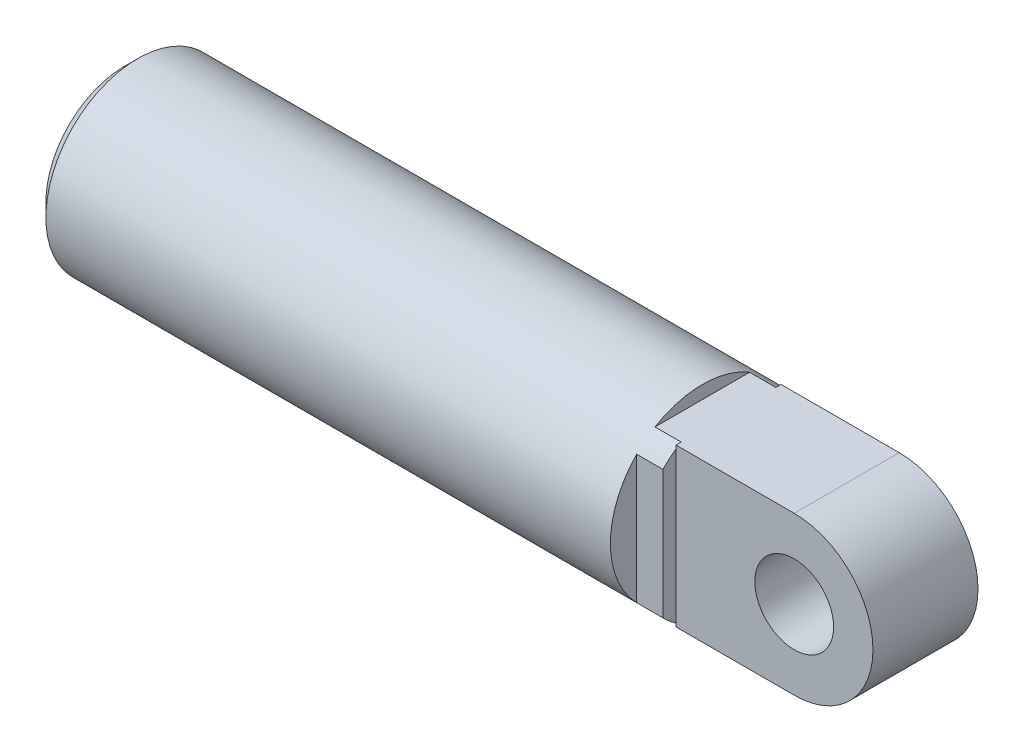
ISO-10303-21;
HEADER;
FILE_DESCRIPTION(('STEP AP214'),'2;1');
FILE_NAME('part.step','',(''),(''),'','','');
FILE_SCHEMA(('AUTOMOTIVE_DESIGN { 1 0 10303 214 1 1 1 1 }'));
ENDSEC;
DATA;
#1=APPLICATION_CONTEXT('core data for automotive mechanical design processes');
#2=APPLICATION_PROTOCOL_DEFINITION('international standard','automotive_design',2000,#1);
#3=PRODUCT_CONTEXT('',#1,'mechanical');
#4=PRODUCT('Part','Part','',(#3));
#5=PRODUCT_RELATED_PRODUCT_CATEGORY('part','',(#4));
#6=PRODUCT_DEFINITION_FORMATION('','',#4);
#7=PRODUCT_DEFINITION_CONTEXT('part definition',#1,'design');
#8=PRODUCT_DEFINITION('design','',#6,#7);
#9=PRODUCT_DEFINITION_SHAPE('','',#8);
#10=(LENGTH_UNIT() NAMED_UNIT(*) SI_UNIT(.MILLI.,.METRE.));
#11=(NAMED_UNIT(*) PLANE_ANGLE_UNIT() SI_UNIT($,.RADIAN.));
#12=(NAMED_UNIT(*) SI_UNIT($,.STERADIAN.) SOLID_ANGLE_UNIT());
#13=UNCERTAINTY_MEASURE_WITH_UNIT(LENGTH_MEASURE(1.E-05),#10,'distance_accuracy_value','');
#14=(GEOMETRIC_REPRESENTATION_CONTEXT(3) GLOBAL_UNCERTAINTY_ASSIGNED_CONTEXT((#13)) GLOBAL_UNIT_ASSIGNED_CONTEXT((#10,
#11,#12)) REPRESENTATION_CONTEXT('',''));
#15=CARTESIAN_POINT('',(0.,0.,0.));
#16=DIRECTION('',(0.,0.,1.));
#17=DIRECTION('',(1.,0.,0.));
#18=AXIS2_PLACEMENT_3D('',#15,#16,#17);
#19=CARTESIAN_POINT('',(46.,0.,0.));
#20=DIRECTION('',(1.,0.,0.));
#21=DIRECTION('',(0.,0.,-1.));
#22=AXIS2_PLACEMENT_3D('',#19,#20,#21);
#23=PLANE('',#22);
#24=CARTESIAN_POINT('',(46.,0.,0.));
#25=DIRECTION('',(1.,0.,0.));
#26=DIRECTION('',(0.,0.,-1.));
#27=AXIS2_PLACEMENT_3D('',#24,#25,#26);
#28=CIRCLE('',#27,7.);
#29=CARTESIAN_POINT('',(46.,4.89897948556636,-5.));
#30=VERTEX_POINT('',#29);
#31=CARTESIAN_POINT('',(46.,5.74456264653803,-4.));
#32=VERTEX_POINT('',#31);
#33=EDGE_CURVE('E210',#30,#32,#28,.T.);
#34=ORIENTED_EDGE('',*,*,#33,.T.);
#35=DIRECTION('',(0.,-1.,0.));
#36=VECTOR('',#35,1.);
#37=CARTESIAN_POINT('',(46.,-6.,-4.));
#38=LINE('',#37,#36);
#39=CARTESIAN_POINT('',(46.,-5.74456264653803,-4.));
#40=VERTEX_POINT('',#39);
#41=EDGE_CURVE('E187',#32,#40,#38,.T.);
#42=ORIENTED_EDGE('',*,*,#41,.T.);
#43=CARTESIAN_POINT('',(46.,0.,0.));
#44=DIRECTION('',(1.,0.,0.));
#45=DIRECTION('',(0.,0.,-1.));
#46=AXIS2_PLACEMENT_3D('',#43,#44,#45);
#47=CIRCLE('',#46,7.);
#48=CARTESIAN_POINT('',(46.,-4.89897948556636,-5.));
#49=VERTEX_POINT('',#48);
#50=EDGE_CURVE('E208',#40,#49,#47,.T.);
#51=ORIENTED_EDGE('',*,*,#50,.T.);
#52=DIRECTION('',(0.,1.,0.));
#53=VECTOR('',#52,1.);
#54=CARTESIAN_POINT('',(46.,-4.89897948556636,-5.));
#55=LINE('',#54,#53);
#56=EDGE_CURVE('E207',#49,#30,#55,.T.);
#57=ORIENTED_EDGE('',*,*,#56,.T.);
#58=EDGE_LOOP('',(#34,#42,#51,#57));
#59=FACE_BOUND('',#58,.T.);
#60=ADVANCED_FACE('F41',(#59),#23,.T.);
#61=CARTESIAN_POINT('',(44.,0.,0.));
#62=DIRECTION('',(1.,0.,0.));
#63=DIRECTION('',(0.,0.,-1.));
#64=AXIS2_PLACEMENT_3D('',#61,#62,#63);
#65=PLANE('',#64);
#66=DIRECTION('',(0.,0.,-1.));
#67=VECTOR('',#66,1.);
#68=CARTESIAN_POINT('',(44.,-6.,3.60555127546399));
#69=LINE('',#68,#67);
#70=CARTESIAN_POINT('',(44.,-6.,3.60555127546399));
#71=VERTEX_POINT('',#70);
#72=CARTESIAN_POINT('',(44.,-6.,-3.60555127546399));
#73=VERTEX_POINT('',#72);
#74=EDGE_CURVE('E230',#71,#73,#69,.T.);
#75=ORIENTED_EDGE('',*,*,#74,.F.);
#76=CARTESIAN_POINT('',(44.,0.,0.));
#77=DIRECTION('',(1.,0.,0.));
#78=DIRECTION('',(0.,0.,-1.));
#79=AXIS2_PLACEMENT_3D('',#76,#77,#78);
#80=CIRCLE('',#79,7.);
#81=EDGE_CURVE('E257',#71,#73,#80,.T.);
#82=ORIENTED_EDGE('',*,*,#81,.T.);
#83=EDGE_LOOP('',(#75,#82));
#84=FACE_BOUND('',#83,.T.);
#85=ADVANCED_FACE('F326',(#84),#65,.T.);
#86=DIRECTION('',(0.,-1.,0.));
#87=VECTOR('',#86,1.);
#88=CARTESIAN_POINT('',(44.,-4.89897948556636,5.));
#89=LINE('',#88,#87);
#90=CARTESIAN_POINT('',(44.,4.89897948556636,5.));
#91=VERTEX_POINT('',#90);
#92=CARTESIAN_POINT('',(44.,-4.89897948556636,5.));
#93=VERTEX_POINT('',#92);
#94=EDGE_CURVE('E227',#91,#93,#89,.T.);
#95=ORIENTED_EDGE('',*,*,#94,.F.);
#96=EDGE_CURVE('E301',#91,#93,#80,.T.);
#97=ORIENTED_EDGE('',*,*,#96,.T.);
#98=EDGE_LOOP('',(#95,#97));
#99=FACE_BOUND('',#98,.T.);
#100=ADVANCED_FACE('F332',(#99),#65,.T.);
#101=DIRECTION('',(0.,0.,1.));
#102=VECTOR('',#101,1.);
#103=CARTESIAN_POINT('',(44.,6.,3.60555127546399));
#104=LINE('',#103,#102);
#105=CARTESIAN_POINT('',(44.,6.,-3.60555127546399));
#106=VERTEX_POINT('',#105);
#107=CARTESIAN_POINT('',(44.,6.,3.60555127546399));
#108=VERTEX_POINT('',#107);
#109=EDGE_CURVE('E224',#106,#108,#104,.T.);
#110=ORIENTED_EDGE('',*,*,#109,.F.);
#111=EDGE_CURVE('E258',#106,#108,#80,.T.);
#112=ORIENTED_EDGE('',*,*,#111,.T.);
#113=EDGE_LOOP('',(#110,#112));
#114=FACE_BOUND('',#113,.T.);
#115=ADVANCED_FACE('F305',(#114),#65,.T.);
#116=CARTESIAN_POINT('',(44.,0.,0.));
#117=DIRECTION('',(-1.,0.,0.));
#118=DIRECTION('',(0.,0.,1.));
#119=AXIS2_PLACEMENT_3D('',#116,#117,#118);
#120=CYLINDRICAL_SURFACE('',#119,7.);
#121=CARTESIAN_POINT('',(1.00000000000001,0.,0.));
#122=DIRECTION('',(1.,0.,0.));
#123=DIRECTION('',(0.,0.,-1.));
#124=AXIS2_PLACEMENT_3D('',#121,#122,#123);
#125=CIRCLE('',#124,7.);
#126=CARTESIAN_POINT('',(1.00000000000001,0.,-7.));
#127=VERTEX_POINT('',#126);
#128=EDGE_CURVE('E50',#127,#127,#125,.T.);
#129=ORIENTED_EDGE('',*,*,#128,.T.);
#130=EDGE_LOOP('',(#129));
#131=FACE_BOUND('',#130,.T.);
#132=ORIENTED_EDGE('',*,*,#111,.F.);
#133=DIRECTION('',(-1.,0.,0.));
#134=VECTOR('',#133,1.);
#135=CARTESIAN_POINT('',(46.,6.,-3.60555127546399));
#136=LINE('',#135,#134);
#137=CARTESIAN_POINT('',(46.,6.,-3.60555127546399));
#138=VERTEX_POINT('',#137);
#139=EDGE_CURVE('E247',#138,#106,#136,.T.);
#140=ORIENTED_EDGE('',*,*,#139,.F.);
#141=EDGE_CURVE('E65',#32,#138,#28,.T.);
#142=ORIENTED_EDGE('',*,*,#141,.F.);
#143=ORIENTED_EDGE('',*,*,#33,.F.);
#144=DIRECTION('',(-1.,0.,0.));
#145=VECTOR('',#144,1.);
#146=CARTESIAN_POINT('',(46.,4.89897948556636,-5.));
#147=LINE('',#146,#145);
#148=CARTESIAN_POINT('',(44.,4.89897948556636,-5.));
#149=VERTEX_POINT('',#148);
#150=EDGE_CURVE('E250',#30,#149,#147,.T.);
#151=ORIENTED_EDGE('',*,*,#150,.T.);
#152=CARTESIAN_POINT('',(44.,-4.89897948556636,-5.));
#153=VERTEX_POINT('',#152);
#154=EDGE_CURVE('E256',#153,#149,#80,.T.);
#155=ORIENTED_EDGE('',*,*,#154,.F.);
#156=DIRECTION('',(-1.,0.,0.));
#157=VECTOR('',#156,1.);
#158=CARTESIAN_POINT('',(46.,-4.89897948556636,-5.));
#159=LINE('',#158,#157);
#160=EDGE_CURVE('E253',#49,#153,#159,.T.);
#161=ORIENTED_EDGE('',*,*,#160,.F.);
#162=ORIENTED_EDGE('',*,*,#50,.F.);
#163=CARTESIAN_POINT('',(46.,-6.,-3.60555127546399));
#164=VERTEX_POINT('',#163);
#165=EDGE_CURVE('E204',#164,#40,#47,.T.);
#166=ORIENTED_EDGE('',*,*,#165,.F.);
#167=DIRECTION('',(-1.,0.,0.));
#168=VECTOR('',#167,1.);
#169=CARTESIAN_POINT('',(46.,-6.,-3.60555127546399));
#170=LINE('',#169,#168);
#171=EDGE_CURVE('E221',#164,#73,#170,.T.);
#172=ORIENTED_EDGE('',*,*,#171,.T.);
#173=ORIENTED_EDGE('',*,*,#81,.F.);
#174=DIRECTION('',(-1.,0.,0.));
#175=VECTOR('',#174,1.);
#176=CARTESIAN_POINT('',(46.,-6.,3.60555127546399));
#177=LINE('',#176,#175);
#178=CARTESIAN_POINT('',(46.,-6.,3.60555127546399));
#179=VERTEX_POINT('',#178);
#180=EDGE_CURVE('E235',#179,#71,#177,.T.);
#181=ORIENTED_EDGE('',*,*,#180,.F.);
#182=CARTESIAN_POINT('',(46.,0.,0.));
#183=DIRECTION('',(1.,0.,0.));
#184=DIRECTION('',(0.,0.,-1.));
#185=AXIS2_PLACEMENT_3D('',#182,#183,#184);
#186=CIRCLE('',#185,7.);
#187=CARTESIAN_POINT('',(46.,-5.74456264653803,4.));
#188=VERTEX_POINT('',#187);
#189=EDGE_CURVE('E218',#188,#179,#186,.T.);
#190=ORIENTED_EDGE('',*,*,#189,.F.);
#191=CARTESIAN_POINT('',(46.,-4.89897948556636,5.));
#192=VERTEX_POINT('',#191);
#193=EDGE_CURVE('E219',#192,#188,#186,.T.);
#194=ORIENTED_EDGE('',*,*,#193,.F.);
#195=DIRECTION('',(-1.,0.,0.));
#196=VECTOR('',#195,1.);
#197=CARTESIAN_POINT('',(46.,-4.89897948556636,5.));
#198=LINE('',#197,#196);
#199=EDGE_CURVE('E238',#192,#93,#198,.T.);
#200=ORIENTED_EDGE('',*,*,#199,.T.);
#201=ORIENTED_EDGE('',*,*,#96,.F.);
#202=DIRECTION('',(-1.,0.,0.));
#203=VECTOR('',#202,1.);
#204=CARTESIAN_POINT('',(46.,4.89897948556636,5.));
#205=LINE('',#204,#203);
#206=CARTESIAN_POINT('',(46.,4.89897948556636,5.));
#207=VERTEX_POINT('',#206);
#208=EDGE_CURVE('E241',#207,#91,#205,.T.);
#209=ORIENTED_EDGE('',*,*,#208,.F.);
#210=CARTESIAN_POINT('',(46.,0.,0.));
#211=DIRECTION('',(1.,0.,0.));
#212=DIRECTION('',(0.,0.,-1.));
#213=AXIS2_PLACEMENT_3D('',#210,#211,#212);
#214=CIRCLE('',#213,7.);
#215=CARTESIAN_POINT('',(46.,5.74456264653803,4.));
#216=VERTEX_POINT('',#215);
#217=EDGE_CURVE('E212',#216,#207,#214,.T.);
#218=ORIENTED_EDGE('',*,*,#217,.F.);
#219=CARTESIAN_POINT('',(46.,6.,3.60555127546399));
#220=VERTEX_POINT('',#219);
#221=EDGE_CURVE('E213',#220,#216,#214,.T.);
#222=ORIENTED_EDGE('',*,*,#221,.F.);
#223=DIRECTION('',(-1.,0.,0.));
#224=VECTOR('',#223,1.);
#225=CARTESIAN_POINT('',(46.,6.,3.60555127546399));
#226=LINE('',#225,#224);
#227=EDGE_CURVE('E244',#220,#108,#226,.T.);
#228=ORIENTED_EDGE('',*,*,#227,.T.);
#229=EDGE_LOOP('',(#132,#140,#142,#143,#151,#155,#161,#162,#166,#172,#173,#181,#190,#194,#200,
#201,#209,#218,#222,#228));
#230=FACE_BOUND('',#229,.T.);
#231=ADVANCED_FACE('F298',(#131,#230),#120,.T.);
#232=DIRECTION('',(0.,1.,0.));
#233=VECTOR('',#232,1.);
#234=CARTESIAN_POINT('',(44.,-4.89897948556636,-5.));
#235=LINE('',#234,#233);
#236=EDGE_CURVE('E203',#153,#149,#235,.T.);
#237=ORIENTED_EDGE('',*,*,#236,.F.);
#238=ORIENTED_EDGE('',*,*,#154,.T.);
#239=EDGE_LOOP('',(#237,#238));
#240=FACE_BOUND('',#239,.T.);
#241=ADVANCED_FACE('F334',(#240),#65,.T.);
#242=CARTESIAN_POINT('',(0.,0.,0.));
#243=DIRECTION('',(1.,0.,0.));
#244=DIRECTION('',(0.,0.,-1.));
#245=AXIS2_PLACEMENT_3D('',#242,#243,#244);
#246=PLANE('',#245);
#247=CARTESIAN_POINT('',(0.,0.,0.));
#248=DIRECTION('',(1.,0.,0.));
#249=DIRECTION('',(0.,0.,-1.));
#250=AXIS2_PLACEMENT_3D('',#247,#248,#249);
#251=CIRCLE('',#250,5.99999999999999);
#252=CARTESIAN_POINT('',(0.,0.,-5.99999999999999));
#253=VERTEX_POINT('',#252);
#254=EDGE_CURVE('E11',#253,#253,#251,.F.);
#255=ORIENTED_EDGE('',*,*,#254,.T.);
#256=EDGE_LOOP('',(#255));
#257=FACE_BOUND('',#256,.T.);
#258=CARTESIAN_POINT('',(0.,0.,0.));
#259=DIRECTION('',(-1.,0.,0.));
#260=DIRECTION('',(0.,0.,1.));
#261=AXIS2_PLACEMENT_3D('',#258,#259,#260);
#262=CIRCLE('',#261,2.1);
#263=CARTESIAN_POINT('',(0.,0.,2.1));
#264=VERTEX_POINT('',#263);
#265=EDGE_CURVE('E156',#264,#264,#262,.T.);
#266=ORIENTED_EDGE('',*,*,#265,.F.);
#267=EDGE_LOOP('',(#266));
#268=FACE_BOUND('',#267,.T.);
#269=ADVANCED_FACE('F349',(#257,#268),#246,.F.);
#270=CARTESIAN_POINT('',(46.,-4.89897948556636,-5.));
#271=DIRECTION('',(0.,0.,1.));
#272=DIRECTION('',(1.,0.,0.));
#273=AXIS2_PLACEMENT_3D('',#270,#271,#272);
#274=PLANE('',#273);
#275=ORIENTED_EDGE('',*,*,#236,.T.);
#276=ORIENTED_EDGE('',*,*,#150,.F.);
#277=ORIENTED_EDGE('',*,*,#56,.F.);
#278=ORIENTED_EDGE('',*,*,#160,.T.);
#279=EDGE_LOOP('',(#275,#276,#277,#278));
#280=FACE_BOUND('',#279,.T.);
#281=ADVANCED_FACE('F347',(#280),#274,.F.);
#282=CARTESIAN_POINT('',(46.,6.,3.60555127546399));
#283=DIRECTION('',(0.,-1.,0.));
#284=DIRECTION('',(0.,0.,-1.));
#285=AXIS2_PLACEMENT_3D('',#282,#283,#284);
#286=PLANE('',#285);
#287=ORIENTED_EDGE('',*,*,#109,.T.);
#288=ORIENTED_EDGE('',*,*,#227,.F.);
#289=DIRECTION('',(0.,0.,-1.));
#290=VECTOR('',#289,1.);
#291=CARTESIAN_POINT('',(46.,6.,4.));
#292=LINE('',#291,#290);
#293=CARTESIAN_POINT('',(46.,6.,4.));
#294=VERTEX_POINT('',#293);
#295=EDGE_CURVE('E200',#294,#220,#292,.T.);
#296=ORIENTED_EDGE('',*,*,#295,.F.);
#297=DIRECTION('',(-1.,0.,0.));
#298=VECTOR('',#297,1.);
#299=CARTESIAN_POINT('',(55.,6.,4.));
#300=LINE('',#299,#298);
#301=CARTESIAN_POINT('',(55.,6.,4.));
#302=VERTEX_POINT('',#301);
#303=EDGE_CURVE('E167',#302,#294,#300,.T.);
#304=ORIENTED_EDGE('',*,*,#303,.F.);
#305=DIRECTION('',(0.,0.,-1.));
#306=VECTOR('',#305,1.);
#307=CARTESIAN_POINT('',(55.,6.,4.));
#308=LINE('',#307,#306);
#309=CARTESIAN_POINT('',(55.,6.,-4.));
#310=VERTEX_POINT('',#309);
#311=EDGE_CURVE('E179',#302,#310,#308,.T.);
#312=ORIENTED_EDGE('',*,*,#311,.T.);
#313=DIRECTION('',(-1.,0.,0.));
#314=VECTOR('',#313,1.);
#315=CARTESIAN_POINT('',(55.,6.,-4.));
#316=LINE('',#315,#314);
#317=CARTESIAN_POINT('',(46.,6.,-4.));
#318=VERTEX_POINT('',#317);
#319=EDGE_CURVE('E165',#310,#318,#316,.T.);
#320=ORIENTED_EDGE('',*,*,#319,.T.);
#321=EDGE_CURVE('E199',#138,#318,#292,.T.);
#322=ORIENTED_EDGE('',*,*,#321,.F.);
#323=ORIENTED_EDGE('',*,*,#139,.T.);
#324=EDGE_LOOP('',(#287,#288,#296,#304,#312,#320,#322,#323));
#325=FACE_BOUND('',#324,.T.);
#326=ADVANCED_FACE('F307',(#325),#286,.F.);
#327=CARTESIAN_POINT('',(46.,-4.89897948556636,5.));
#328=DIRECTION('',(0.,0.,-1.));
#329=DIRECTION('',(-1.,0.,0.));
#330=AXIS2_PLACEMENT_3D('',#327,#328,#329);
#331=PLANE('',#330);
#332=ORIENTED_EDGE('',*,*,#94,.T.);
#333=ORIENTED_EDGE('',*,*,#199,.F.);
#334=DIRECTION('',(0.,-1.,0.));
#335=VECTOR('',#334,1.);
#336=CARTESIAN_POINT('',(46.,-4.89897948556636,5.));
#337=LINE('',#336,#335);
#338=EDGE_CURVE('E216',#207,#192,#337,.T.);
#339=ORIENTED_EDGE('',*,*,#338,.F.);
#340=ORIENTED_EDGE('',*,*,#208,.T.);
#341=EDGE_LOOP('',(#332,#333,#339,#340));
#342=FACE_BOUND('',#341,.T.);
#343=ADVANCED_FACE('F340',(#342),#331,.F.);
#344=CARTESIAN_POINT('',(46.,-6.,3.60555127546399));
#345=DIRECTION('',(0.,1.,0.));
#346=DIRECTION('',(0.,0.,1.));
#347=AXIS2_PLACEMENT_3D('',#344,#345,#346);
#348=PLANE('',#347);
#349=ORIENTED_EDGE('',*,*,#74,.T.);
#350=ORIENTED_EDGE('',*,*,#171,.F.);
#351=DIRECTION('',(0.,0.,-1.));
#352=VECTOR('',#351,1.);
#353=CARTESIAN_POINT('',(46.,-6.,4.));
#354=LINE('',#353,#352);
#355=CARTESIAN_POINT('',(46.,-6.,-4.));
#356=VERTEX_POINT('',#355);
#357=EDGE_CURVE('E195',#164,#356,#354,.T.);
#358=ORIENTED_EDGE('',*,*,#357,.T.);
#359=DIRECTION('',(1.,0.,0.));
#360=VECTOR('',#359,1.);
#361=CARTESIAN_POINT('',(46.,-6.,-4.));
#362=LINE('',#361,#360);
#363=CARTESIAN_POINT('',(55.,-6.,-4.));
#364=VERTEX_POINT('',#363);
#365=EDGE_CURVE('E186',#356,#364,#362,.T.);
#366=ORIENTED_EDGE('',*,*,#365,.T.);
#367=DIRECTION('',(0.,0.,-1.));
#368=VECTOR('',#367,1.);
#369=CARTESIAN_POINT('',(55.,-6.,4.));
#370=LINE('',#369,#368);
#371=CARTESIAN_POINT('',(55.,-6.,4.));
#372=VERTEX_POINT('',#371);
#373=EDGE_CURVE('E192',#372,#364,#370,.T.);
#374=ORIENTED_EDGE('',*,*,#373,.F.);
#375=DIRECTION('',(1.,0.,0.));
#376=VECTOR('',#375,1.);
#377=CARTESIAN_POINT('',(46.,-6.,4.));
#378=LINE('',#377,#376);
#379=CARTESIAN_POINT('',(46.,-6.,4.));
#380=VERTEX_POINT('',#379);
#381=EDGE_CURVE('E175',#380,#372,#378,.T.);
#382=ORIENTED_EDGE('',*,*,#381,.F.);
#383=EDGE_CURVE('E196',#380,#179,#354,.T.);
#384=ORIENTED_EDGE('',*,*,#383,.T.);
#385=ORIENTED_EDGE('',*,*,#180,.T.);
#386=EDGE_LOOP('',(#349,#350,#358,#366,#374,#382,#384,#385));
#387=FACE_BOUND('',#386,.T.);
#388=ADVANCED_FACE('F279',(#387),#348,.F.);
#389=DIRECTION('',(0.,-1.,0.));
#390=VECTOR('',#389,1.);
#391=CARTESIAN_POINT('',(46.,-6.,4.));
#392=LINE('',#391,#390);
#393=EDGE_CURVE('E57',#216,#188,#392,.T.);
#394=ORIENTED_EDGE('',*,*,#393,.F.);
#395=ORIENTED_EDGE('',*,*,#217,.T.);
#396=ORIENTED_EDGE('',*,*,#338,.T.);
#397=ORIENTED_EDGE('',*,*,#193,.T.);
#398=EDGE_LOOP('',(#394,#395,#396,#397));
#399=FACE_BOUND('',#398,.T.);
#400=ADVANCED_FACE('F322',(#399),#23,.T.);
#401=CARTESIAN_POINT('',(46.,-6.,4.));
#402=DIRECTION('',(1.,0.,0.));
#403=DIRECTION('',(0.,0.,-1.));
#404=AXIS2_PLACEMENT_3D('',#401,#402,#403);
#405=PLANE('',#404);
#406=ORIENTED_EDGE('',*,*,#357,.F.);
#407=ORIENTED_EDGE('',*,*,#165,.T.);
#408=EDGE_CURVE('E182',#40,#356,#38,.T.);
#409=ORIENTED_EDGE('',*,*,#408,.T.);
#410=EDGE_LOOP('',(#406,#407,#409));
#411=FACE_BOUND('',#410,.T.);
#412=ADVANCED_FACE('F270',(#411),#405,.F.);
#413=EDGE_CURVE('E183',#318,#32,#38,.T.);
#414=ORIENTED_EDGE('',*,*,#413,.T.);
#415=ORIENTED_EDGE('',*,*,#141,.T.);
#416=ORIENTED_EDGE('',*,*,#321,.T.);
#417=EDGE_LOOP('',(#414,#415,#416));
#418=FACE_BOUND('',#417,.T.);
#419=ADVANCED_FACE('F315',(#418),#405,.F.);
#420=ORIENTED_EDGE('',*,*,#295,.T.);
#421=ORIENTED_EDGE('',*,*,#221,.T.);
#422=EDGE_CURVE('E172',#294,#216,#392,.T.);
#423=ORIENTED_EDGE('',*,*,#422,.F.);
#424=EDGE_LOOP('',(#420,#421,#423));
#425=FACE_BOUND('',#424,.T.);
#426=ADVANCED_FACE('F312',(#425),#405,.F.);
#427=EDGE_CURVE('E170',#188,#380,#392,.T.);
#428=ORIENTED_EDGE('',*,*,#427,.F.);
#429=ORIENTED_EDGE('',*,*,#189,.T.);
#430=ORIENTED_EDGE('',*,*,#383,.F.);
#431=EDGE_LOOP('',(#428,#429,#430));
#432=FACE_BOUND('',#431,.T.);
#433=ADVANCED_FACE('F294',(#432),#405,.F.);
#434=CARTESIAN_POINT('',(55.,0.,4.));
#435=DIRECTION('',(0.,0.,1.));
#436=DIRECTION('',(1.,0.,0.));
#437=AXIS2_PLACEMENT_3D('',#434,#435,#436);
#438=PLANE('',#437);
#439=ORIENTED_EDGE('',*,*,#303,.T.);
#440=ORIENTED_EDGE('',*,*,#422,.T.);
#441=ORIENTED_EDGE('',*,*,#393,.T.);
#442=ORIENTED_EDGE('',*,*,#427,.T.);
#443=ORIENTED_EDGE('',*,*,#381,.T.);
#444=CARTESIAN_POINT('',(55.,0.,4.));
#445=DIRECTION('',(0.,0.,1.));
#446=DIRECTION('',(1.,0.,0.));
#447=AXIS2_PLACEMENT_3D('',#444,#445,#446);
#448=CIRCLE('',#447,6.);
#449=EDGE_CURVE('E177',#372,#302,#448,.T.);
#450=ORIENTED_EDGE('',*,*,#449,.T.);
#451=EDGE_LOOP('',(#439,#440,#441,#442,#443,#450));
#452=FACE_BOUND('',#451,.T.);
#453=CARTESIAN_POINT('',(55.,0.,4.));
#454=DIRECTION('',(0.,0.,1.));
#455=DIRECTION('',(1.,0.,0.));
#456=AXIS2_PLACEMENT_3D('',#453,#454,#455);
#457=CIRCLE('',#456,3.);
#458=CARTESIAN_POINT('',(58.,0.,4.));
#459=VERTEX_POINT('',#458);
#460=EDGE_CURVE('E159',#459,#459,#457,.T.);
#461=ORIENTED_EDGE('',*,*,#460,.F.);
#462=EDGE_LOOP('',(#461));
#463=FACE_BOUND('',#462,.T.);
#464=ADVANCED_FACE('F287',(#452,#463),#438,.T.);
#465=CARTESIAN_POINT('',(55.,0.,-4.));
#466=DIRECTION('',(0.,0.,1.));
#467=DIRECTION('',(1.,0.,0.));
#468=AXIS2_PLACEMENT_3D('',#465,#466,#467);
#469=PLANE('',#468);
#470=ORIENTED_EDGE('',*,*,#319,.F.);
#471=CARTESIAN_POINT('',(55.,0.,-4.));
#472=DIRECTION('',(0.,0.,1.));
#473=DIRECTION('',(1.,0.,0.));
#474=AXIS2_PLACEMENT_3D('',#471,#472,#473);
#475=CIRCLE('',#474,6.);
#476=EDGE_CURVE('E171',#364,#310,#475,.T.);
#477=ORIENTED_EDGE('',*,*,#476,.F.);
#478=ORIENTED_EDGE('',*,*,#365,.F.);
#479=ORIENTED_EDGE('',*,*,#408,.F.);
#480=ORIENTED_EDGE('',*,*,#41,.F.);
#481=ORIENTED_EDGE('',*,*,#413,.F.);
#482=EDGE_LOOP('',(#470,#477,#478,#479,#480,#481));
#483=FACE_BOUND('',#482,.T.);
#484=CARTESIAN_POINT('',(55.,0.,-4.));
#485=DIRECTION('',(0.,0.,1.));
#486=DIRECTION('',(1.,0.,0.));
#487=AXIS2_PLACEMENT_3D('',#484,#485,#486);
#488=CIRCLE('',#487,3.);
#489=CARTESIAN_POINT('',(58.,0.,-4.));
#490=VERTEX_POINT('',#489);
#491=EDGE_CURVE('E155',#490,#490,#488,.T.);
#492=ORIENTED_EDGE('',*,*,#491,.T.);
#493=EDGE_LOOP('',(#492));
#494=FACE_BOUND('',#493,.T.);
#495=ADVANCED_FACE('F275',(#483,#494),#469,.F.);
#496=CARTESIAN_POINT('',(55.,0.,4.));
#497=DIRECTION('',(0.,0.,-1.));
#498=DIRECTION('',(-1.,0.,0.));
#499=AXIS2_PLACEMENT_3D('',#496,#497,#498);
#500=CYLINDRICAL_SURFACE('',#499,6.);
#501=ORIENTED_EDGE('',*,*,#476,.T.);
#502=ORIENTED_EDGE('',*,*,#311,.F.);
#503=ORIENTED_EDGE('',*,*,#449,.F.);
#504=ORIENTED_EDGE('',*,*,#373,.T.);
#505=EDGE_LOOP('',(#501,#502,#503,#504));
#506=FACE_BOUND('',#505,.T.);
#507=ADVANCED_FACE('F283',(#506),#500,.T.);
#508=CARTESIAN_POINT('',(55.,0.,4.));
#509=DIRECTION('',(0.,0.,-1.));
#510=DIRECTION('',(-1.,0.,0.));
#511=AXIS2_PLACEMENT_3D('',#508,#509,#510);
#512=CYLINDRICAL_SURFACE('',#511,3.);
#513=ORIENTED_EDGE('',*,*,#460,.T.);
#514=EDGE_LOOP('',(#513));
#515=FACE_BOUND('',#514,.T.);
#516=ORIENTED_EDGE('',*,*,#491,.F.);
#517=EDGE_LOOP('',(#516));
#518=FACE_BOUND('',#517,.T.);
#519=ADVANCED_FACE('F149',(#515,#518),#512,.F.);
#520=CARTESIAN_POINT('',(15.,0.,0.));
#521=DIRECTION('',(-1.,0.,0.));
#522=DIRECTION('',(0.,0.,1.));
#523=AXIS2_PLACEMENT_3D('',#520,#521,#522);
#524=CONICAL_SURFACE('',#523,2.1,1.02974425867665);
#525=CARTESIAN_POINT('',(16.2618072999579,0.,0.));
#526=VERTEX_POINT('',#525);
#527=VERTEX_LOOP('',#526);
#528=FACE_BOUND('',#527,.T.);
#529=CARTESIAN_POINT('',(15.,0.,0.));
#530=DIRECTION('',(-1.,0.,0.));
#531=DIRECTION('',(0.,0.,1.));
#532=AXIS2_PLACEMENT_3D('',#529,#530,#531);
#533=CIRCLE('',#532,2.1);
#534=CARTESIAN_POINT('',(15.,0.,2.1));
#535=VERTEX_POINT('',#534);
#536=EDGE_CURVE('E153',#535,#535,#533,.T.);
#537=ORIENTED_EDGE('',*,*,#536,.T.);
#538=EDGE_LOOP('',(#537));
#539=FACE_BOUND('',#538,.T.);
#540=ADVANCED_FACE('F145',(#528,#539),#524,.F.);
#541=CARTESIAN_POINT('',(0.,0.,0.));
#542=DIRECTION('',(-1.,0.,0.));
#543=DIRECTION('',(0.,0.,1.));
#544=AXIS2_PLACEMENT_3D('',#541,#542,#543);
#545=CYLINDRICAL_SURFACE('',#544,2.1);
#546=ORIENTED_EDGE('',*,*,#536,.F.);
#547=EDGE_LOOP('',(#546));
#548=FACE_BOUND('',#547,.T.);
#549=ORIENTED_EDGE('',*,*,#265,.T.);
#550=EDGE_LOOP('',(#549));
#551=FACE_BOUND('',#550,.T.);
#552=ADVANCED_FACE('F148',(#548,#551),#545,.F.);
#553=CARTESIAN_POINT('',(1.00000000000001,0.,0.));
#554=DIRECTION('',(1.,0.,0.));
#555=DIRECTION('',(0.,0.,-1.));
#556=AXIS2_PLACEMENT_3D('',#553,#554,#555);
#557=CONICAL_SURFACE('',#556,7.,0.785398163397449);
#558=ORIENTED_EDGE('',*,*,#254,.F.);
#559=EDGE_LOOP('',(#558));
#560=FACE_BOUND('',#559,.T.);
#561=ORIENTED_EDGE('',*,*,#128,.F.);
#562=EDGE_LOOP('',(#561));
#563=FACE_BOUND('',#562,.T.);
#564=ADVANCED_FACE('F44',(#560,#563),#557,.T.);
#565=CLOSED_SHELL('',(#60,#85,#100,#115,#231,#241,#269,#281,#326,#343,#388,#400,#412,#419,#426,
#433,#464,#495,#507,#519,#540,#552,#564));
#566=MANIFOLD_SOLID_BREP('B2',#565);
#567=ADVANCED_BREP_SHAPE_REPRESENTATION('',(#18,#566),#14);
#568=SHAPE_DEFINITION_REPRESENTATION(#9,#567);
ENDSEC;
END-ISO-10303-21;
